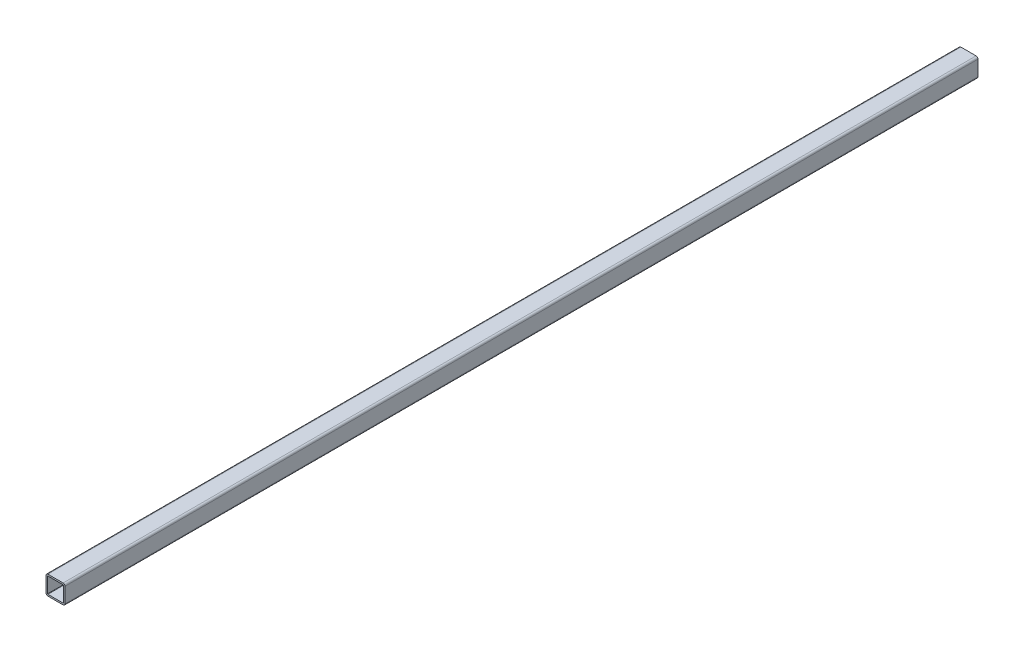
ISO-10303-21;
HEADER;
FILE_DESCRIPTION(('STEP AP214'),'2;1');
FILE_NAME('part.step','',(''),(''),'','','');
FILE_SCHEMA(('AUTOMOTIVE_DESIGN { 1 0 10303 214 1 1 1 1 }'));
ENDSEC;
DATA;
#1=APPLICATION_CONTEXT('core data for automotive mechanical design processes');
#2=APPLICATION_PROTOCOL_DEFINITION('international standard','automotive_design',2000,#1);
#3=PRODUCT_CONTEXT('',#1,'mechanical');
#4=PRODUCT('Part','Part','',(#3));
#5=PRODUCT_RELATED_PRODUCT_CATEGORY('part','',(#4));
#6=PRODUCT_DEFINITION_FORMATION('','',#4);
#7=PRODUCT_DEFINITION_CONTEXT('part definition',#1,'design');
#8=PRODUCT_DEFINITION('design','',#6,#7);
#9=PRODUCT_DEFINITION_SHAPE('','',#8);
#10=(LENGTH_UNIT() NAMED_UNIT(*) SI_UNIT(.MILLI.,.METRE.));
#11=(NAMED_UNIT(*) PLANE_ANGLE_UNIT() SI_UNIT($,.RADIAN.));
#12=(NAMED_UNIT(*) SI_UNIT($,.STERADIAN.) SOLID_ANGLE_UNIT());
#13=UNCERTAINTY_MEASURE_WITH_UNIT(LENGTH_MEASURE(1.E-05),#10,'distance_accuracy_value','');
#14=(GEOMETRIC_REPRESENTATION_CONTEXT(3) GLOBAL_UNCERTAINTY_ASSIGNED_CONTEXT((#13)) GLOBAL_UNIT_ASSIGNED_CONTEXT((#10,
#11,#12)) REPRESENTATION_CONTEXT('',''));
#15=CARTESIAN_POINT('',(0.,0.,0.));
#16=DIRECTION('',(0.,0.,1.));
#17=DIRECTION('',(1.,0.,0.));
#18=AXIS2_PLACEMENT_3D('',#15,#16,#17);
#19=CARTESIAN_POINT('',(0.,0.,457.2));
#20=DIRECTION('',(0.,0.,1.));
#21=DIRECTION('',(1.,0.,0.));
#22=AXIS2_PLACEMENT_3D('',#19,#20,#21);
#23=PLANE('',#22);
#24=DIRECTION('',(0.,-1.,0.));
#25=VECTOR('',#24,1.);
#26=CARTESIAN_POINT('',(-9.525,-9.525,457.2));
#27=LINE('',#26,#25);
#28=CARTESIAN_POINT('',(-9.525,7.61999999999999,457.2));
#29=VERTEX_POINT('',#28);
#30=CARTESIAN_POINT('',(-9.525,-7.62,457.2));
#31=VERTEX_POINT('',#30);
#32=EDGE_CURVE('E198',#29,#31,#27,.T.);
#33=ORIENTED_EDGE('',*,*,#32,.T.);
#34=CARTESIAN_POINT('',(-7.62,-7.62,457.2));
#35=DIRECTION('',(0.,0.,1.));
#36=DIRECTION('',(1.,0.,0.));
#37=AXIS2_PLACEMENT_3D('',#34,#35,#36);
#38=CIRCLE('',#37,1.905);
#39=CARTESIAN_POINT('',(-7.62,-9.525,457.2));
#40=VERTEX_POINT('',#39);
#41=EDGE_CURVE('E229',#31,#40,#38,.T.);
#42=ORIENTED_EDGE('',*,*,#41,.T.);
#43=DIRECTION('',(1.,0.,0.));
#44=VECTOR('',#43,1.);
#45=CARTESIAN_POINT('',(-9.525,-9.525,457.2));
#46=LINE('',#45,#44);
#47=CARTESIAN_POINT('',(7.61999999999999,-9.525,457.2));
#48=VERTEX_POINT('',#47);
#49=EDGE_CURVE('E177',#40,#48,#46,.T.);
#50=ORIENTED_EDGE('',*,*,#49,.T.);
#51=CARTESIAN_POINT('',(7.62,-7.62,457.2));
#52=DIRECTION('',(0.,0.,1.));
#53=DIRECTION('',(1.,0.,0.));
#54=AXIS2_PLACEMENT_3D('',#51,#52,#53);
#55=CIRCLE('',#54,1.905);
#56=CARTESIAN_POINT('',(9.525,-7.62,457.2));
#57=VERTEX_POINT('',#56);
#58=EDGE_CURVE('E223',#48,#57,#55,.T.);
#59=ORIENTED_EDGE('',*,*,#58,.T.);
#60=DIRECTION('',(0.,1.,0.));
#61=VECTOR('',#60,1.);
#62=CARTESIAN_POINT('',(9.525,-9.525,457.2));
#63=LINE('',#62,#61);
#64=CARTESIAN_POINT('',(9.525,7.61999999999999,457.2));
#65=VERTEX_POINT('',#64);
#66=EDGE_CURVE('E330',#57,#65,#63,.T.);
#67=ORIENTED_EDGE('',*,*,#66,.T.);
#68=CARTESIAN_POINT('',(7.62,7.62,457.2));
#69=DIRECTION('',(0.,0.,1.));
#70=DIRECTION('',(1.,0.,0.));
#71=AXIS2_PLACEMENT_3D('',#68,#69,#70);
#72=CIRCLE('',#71,1.905);
#73=CARTESIAN_POINT('',(7.61999999999999,9.525,457.2));
#74=VERTEX_POINT('',#73);
#75=EDGE_CURVE('E220',#65,#74,#72,.T.);
#76=ORIENTED_EDGE('',*,*,#75,.T.);
#77=DIRECTION('',(-1.,0.,0.));
#78=VECTOR('',#77,1.);
#79=CARTESIAN_POINT('',(-9.525,9.525,457.2));
#80=LINE('',#79,#78);
#81=CARTESIAN_POINT('',(-7.62,9.525,457.2));
#82=VERTEX_POINT('',#81);
#83=EDGE_CURVE('E333',#74,#82,#80,.T.);
#84=ORIENTED_EDGE('',*,*,#83,.T.);
#85=CARTESIAN_POINT('',(-7.62,7.62,457.2));
#86=DIRECTION('',(0.,0.,1.));
#87=DIRECTION('',(1.,0.,0.));
#88=AXIS2_PLACEMENT_3D('',#85,#86,#87);
#89=CIRCLE('',#88,1.905);
#90=EDGE_CURVE('E226',#82,#29,#89,.T.);
#91=ORIENTED_EDGE('',*,*,#90,.T.);
#92=EDGE_LOOP('',(#33,#42,#50,#59,#67,#76,#84,#91));
#93=FACE_BOUND('',#92,.T.);
#94=DIRECTION('',(0.,1.,0.));
#95=VECTOR('',#94,1.);
#96=CARTESIAN_POINT('',(7.9375,-7.9375,457.2));
#97=LINE('',#96,#95);
#98=CARTESIAN_POINT('',(7.9375,-7.62,457.2));
#99=VERTEX_POINT('',#98);
#100=CARTESIAN_POINT('',(7.9375,7.62,457.2));
#101=VERTEX_POINT('',#100);
#102=EDGE_CURVE('E311',#99,#101,#97,.T.);
#103=ORIENTED_EDGE('',*,*,#102,.F.);
#104=CARTESIAN_POINT('',(7.62,-7.62,457.2));
#105=DIRECTION('',(0.,0.,1.));
#106=DIRECTION('',(1.,0.,0.));
#107=AXIS2_PLACEMENT_3D('',#104,#105,#106);
#108=CIRCLE('',#107,0.3175);
#109=CARTESIAN_POINT('',(7.62,-7.9375,457.2));
#110=VERTEX_POINT('',#109);
#111=EDGE_CURVE('E282',#99,#110,#108,.F.);
#112=ORIENTED_EDGE('',*,*,#111,.T.);
#113=DIRECTION('',(1.,0.,0.));
#114=VECTOR('',#113,1.);
#115=CARTESIAN_POINT('',(-7.9375,-7.9375,457.2));
#116=LINE('',#115,#114);
#117=CARTESIAN_POINT('',(-7.62,-7.9375,457.2));
#118=VERTEX_POINT('',#117);
#119=EDGE_CURVE('E300',#118,#110,#116,.T.);
#120=ORIENTED_EDGE('',*,*,#119,.F.);
#121=CARTESIAN_POINT('',(-7.62,-7.62,457.2));
#122=DIRECTION('',(0.,0.,1.));
#123=DIRECTION('',(1.,0.,0.));
#124=AXIS2_PLACEMENT_3D('',#121,#122,#123);
#125=CIRCLE('',#124,0.3175);
#126=CARTESIAN_POINT('',(-7.9375,-7.62,457.2));
#127=VERTEX_POINT('',#126);
#128=EDGE_CURVE('E57',#118,#127,#125,.F.);
#129=ORIENTED_EDGE('',*,*,#128,.T.);
#130=DIRECTION('',(0.,-1.,0.));
#131=VECTOR('',#130,1.);
#132=CARTESIAN_POINT('',(-7.9375,-7.9375,457.2));
#133=LINE('',#132,#131);
#134=CARTESIAN_POINT('',(-7.9375,7.62,457.2));
#135=VERTEX_POINT('',#134);
#136=EDGE_CURVE('E188',#135,#127,#133,.T.);
#137=ORIENTED_EDGE('',*,*,#136,.F.);
#138=CARTESIAN_POINT('',(-7.62,7.62,457.2));
#139=DIRECTION('',(0.,0.,1.));
#140=DIRECTION('',(1.,0.,0.));
#141=AXIS2_PLACEMENT_3D('',#138,#139,#140);
#142=CIRCLE('',#141,0.3175);
#143=CARTESIAN_POINT('',(-7.62,7.9375,457.2));
#144=VERTEX_POINT('',#143);
#145=EDGE_CURVE('E11',#135,#144,#142,.F.);
#146=ORIENTED_EDGE('',*,*,#145,.T.);
#147=DIRECTION('',(-1.,0.,0.));
#148=VECTOR('',#147,1.);
#149=CARTESIAN_POINT('',(-7.9375,7.9375,457.2));
#150=LINE('',#149,#148);
#151=CARTESIAN_POINT('',(7.62,7.9375,457.2));
#152=VERTEX_POINT('',#151);
#153=EDGE_CURVE('E195',#152,#144,#150,.T.);
#154=ORIENTED_EDGE('',*,*,#153,.F.);
#155=CARTESIAN_POINT('',(7.62,7.62,457.2));
#156=DIRECTION('',(0.,0.,1.));
#157=DIRECTION('',(1.,0.,0.));
#158=AXIS2_PLACEMENT_3D('',#155,#156,#157);
#159=CIRCLE('',#158,0.3175);
#160=EDGE_CURVE('E276',#152,#101,#159,.F.);
#161=ORIENTED_EDGE('',*,*,#160,.T.);
#162=EDGE_LOOP('',(#103,#112,#120,#129,#137,#146,#154,#161));
#163=FACE_BOUND('',#162,.T.);
#164=ADVANCED_FACE('F41',(#93,#163),#23,.T.);
#165=CARTESIAN_POINT('',(0.,0.,-457.2));
#166=DIRECTION('',(0.,0.,1.));
#167=DIRECTION('',(1.,0.,0.));
#168=AXIS2_PLACEMENT_3D('',#165,#166,#167);
#169=PLANE('',#168);
#170=DIRECTION('',(1.,0.,0.));
#171=VECTOR('',#170,1.);
#172=CARTESIAN_POINT('',(-9.525,-9.525,-457.2));
#173=LINE('',#172,#171);
#174=CARTESIAN_POINT('',(-7.62,-9.525,-457.2));
#175=VERTEX_POINT('',#174);
#176=CARTESIAN_POINT('',(7.61999999999999,-9.525,-457.2));
#177=VERTEX_POINT('',#176);
#178=EDGE_CURVE('E174',#175,#177,#173,.T.);
#179=ORIENTED_EDGE('',*,*,#178,.F.);
#180=CARTESIAN_POINT('',(-7.62,-7.62,-457.2));
#181=DIRECTION('',(0.,0.,1.));
#182=DIRECTION('',(1.,0.,0.));
#183=AXIS2_PLACEMENT_3D('',#180,#181,#182);
#184=CIRCLE('',#183,1.905);
#185=CARTESIAN_POINT('',(-9.525,-7.62,-457.2));
#186=VERTEX_POINT('',#185);
#187=EDGE_CURVE('E156',#175,#186,#184,.F.);
#188=ORIENTED_EDGE('',*,*,#187,.T.);
#189=DIRECTION('',(0.,-1.,0.));
#190=VECTOR('',#189,1.);
#191=CARTESIAN_POINT('',(-9.525,-9.525,-457.2));
#192=LINE('',#191,#190);
#193=CARTESIAN_POINT('',(-9.525,7.61999999999999,-457.2));
#194=VERTEX_POINT('',#193);
#195=EDGE_CURVE('E204',#194,#186,#192,.T.);
#196=ORIENTED_EDGE('',*,*,#195,.F.);
#197=CARTESIAN_POINT('',(-7.62,7.62,-457.2));
#198=DIRECTION('',(0.,0.,1.));
#199=DIRECTION('',(1.,0.,0.));
#200=AXIS2_PLACEMENT_3D('',#197,#198,#199);
#201=CIRCLE('',#200,1.905);
#202=CARTESIAN_POINT('',(-7.62,9.525,-457.2));
#203=VERTEX_POINT('',#202);
#204=EDGE_CURVE('E168',#194,#203,#201,.F.);
#205=ORIENTED_EDGE('',*,*,#204,.T.);
#206=DIRECTION('',(-1.,0.,0.));
#207=VECTOR('',#206,1.);
#208=CARTESIAN_POINT('',(-9.525,9.525,-457.2));
#209=LINE('',#208,#207);
#210=CARTESIAN_POINT('',(7.61999999999999,9.525,-457.2));
#211=VERTEX_POINT('',#210);
#212=EDGE_CURVE('E193',#211,#203,#209,.T.);
#213=ORIENTED_EDGE('',*,*,#212,.F.);
#214=CARTESIAN_POINT('',(7.62,7.62,-457.2));
#215=DIRECTION('',(0.,0.,1.));
#216=DIRECTION('',(1.,0.,0.));
#217=AXIS2_PLACEMENT_3D('',#214,#215,#216);
#218=CIRCLE('',#217,1.905);
#219=CARTESIAN_POINT('',(9.525,7.61999999999999,-457.2));
#220=VERTEX_POINT('',#219);
#221=EDGE_CURVE('E179',#211,#220,#218,.F.);
#222=ORIENTED_EDGE('',*,*,#221,.T.);
#223=DIRECTION('',(0.,1.,0.));
#224=VECTOR('',#223,1.);
#225=CARTESIAN_POINT('',(9.525,-9.525,-457.2));
#226=LINE('',#225,#224);
#227=CARTESIAN_POINT('',(9.525,-7.62,-457.2));
#228=VERTEX_POINT('',#227);
#229=EDGE_CURVE('E187',#228,#220,#226,.T.);
#230=ORIENTED_EDGE('',*,*,#229,.F.);
#231=CARTESIAN_POINT('',(7.62,-7.62,-457.2));
#232=DIRECTION('',(0.,0.,1.));
#233=DIRECTION('',(1.,0.,0.));
#234=AXIS2_PLACEMENT_3D('',#231,#232,#233);
#235=CIRCLE('',#234,1.905);
#236=EDGE_CURVE('E185',#228,#177,#235,.F.);
#237=ORIENTED_EDGE('',*,*,#236,.T.);
#238=EDGE_LOOP('',(#179,#188,#196,#205,#213,#222,#230,#237));
#239=FACE_BOUND('',#238,.T.);
#240=DIRECTION('',(0.,-1.,0.));
#241=VECTOR('',#240,1.);
#242=CARTESIAN_POINT('',(-7.9375,-7.9375,-457.2));
#243=LINE('',#242,#241);
#244=CARTESIAN_POINT('',(-7.9375,7.62,-457.2));
#245=VERTEX_POINT('',#244);
#246=CARTESIAN_POINT('',(-7.9375,-7.62,-457.2));
#247=VERTEX_POINT('',#246);
#248=EDGE_CURVE('E292',#245,#247,#243,.T.);
#249=ORIENTED_EDGE('',*,*,#248,.T.);
#250=CARTESIAN_POINT('',(-7.62,-7.62,-457.2));
#251=DIRECTION('',(0.,0.,1.));
#252=DIRECTION('',(1.,0.,0.));
#253=AXIS2_PLACEMENT_3D('',#250,#251,#252);
#254=CIRCLE('',#253,0.3175);
#255=CARTESIAN_POINT('',(-7.62,-7.9375,-457.2));
#256=VERTEX_POINT('',#255);
#257=EDGE_CURVE('E285',#247,#256,#254,.T.);
#258=ORIENTED_EDGE('',*,*,#257,.T.);
#259=DIRECTION('',(1.,0.,0.));
#260=VECTOR('',#259,1.);
#261=CARTESIAN_POINT('',(-7.9375,-7.9375,-457.2));
#262=LINE('',#261,#260);
#263=CARTESIAN_POINT('',(7.62,-7.9375,-457.2));
#264=VERTEX_POINT('',#263);
#265=EDGE_CURVE('E318',#256,#264,#262,.T.);
#266=ORIENTED_EDGE('',*,*,#265,.T.);
#267=CARTESIAN_POINT('',(7.62,-7.62,-457.2));
#268=DIRECTION('',(0.,0.,1.));
#269=DIRECTION('',(1.,0.,0.));
#270=AXIS2_PLACEMENT_3D('',#267,#268,#269);
#271=CIRCLE('',#270,0.3175);
#272=CARTESIAN_POINT('',(7.9375,-7.62,-457.2));
#273=VERTEX_POINT('',#272);
#274=EDGE_CURVE('E279',#264,#273,#271,.T.);
#275=ORIENTED_EDGE('',*,*,#274,.T.);
#276=DIRECTION('',(0.,1.,0.));
#277=VECTOR('',#276,1.);
#278=CARTESIAN_POINT('',(7.9375,-7.9375,-457.2));
#279=LINE('',#278,#277);
#280=CARTESIAN_POINT('',(7.9375,7.62,-457.2));
#281=VERTEX_POINT('',#280);
#282=EDGE_CURVE('E322',#273,#281,#279,.T.);
#283=ORIENTED_EDGE('',*,*,#282,.T.);
#284=CARTESIAN_POINT('',(7.62,7.62,-457.2));
#285=DIRECTION('',(0.,0.,1.));
#286=DIRECTION('',(1.,0.,0.));
#287=AXIS2_PLACEMENT_3D('',#284,#285,#286);
#288=CIRCLE('',#287,0.3175);
#289=CARTESIAN_POINT('',(7.62,7.9375,-457.2));
#290=VERTEX_POINT('',#289);
#291=EDGE_CURVE('E273',#281,#290,#288,.T.);
#292=ORIENTED_EDGE('',*,*,#291,.T.);
#293=DIRECTION('',(-1.,0.,0.));
#294=VECTOR('',#293,1.);
#295=CARTESIAN_POINT('',(-7.9375,7.9375,-457.2));
#296=LINE('',#295,#294);
#297=CARTESIAN_POINT('',(-7.62,7.9375,-457.2));
#298=VERTEX_POINT('',#297);
#299=EDGE_CURVE('E294',#290,#298,#296,.T.);
#300=ORIENTED_EDGE('',*,*,#299,.T.);
#301=CARTESIAN_POINT('',(-7.62,7.62,-457.2));
#302=DIRECTION('',(0.,0.,1.));
#303=DIRECTION('',(1.,0.,0.));
#304=AXIS2_PLACEMENT_3D('',#301,#302,#303);
#305=CIRCLE('',#304,0.3175);
#306=EDGE_CURVE('E50',#298,#245,#305,.T.);
#307=ORIENTED_EDGE('',*,*,#306,.T.);
#308=EDGE_LOOP('',(#249,#258,#266,#275,#283,#292,#300,#307));
#309=FACE_BOUND('',#308,.T.);
#310=ADVANCED_FACE('F182',(#239,#309),#169,.F.);
#311=CARTESIAN_POINT('',(-9.525,-9.525,457.2));
#312=DIRECTION('',(0.,1.,0.));
#313=DIRECTION('',(0.,0.,1.));
#314=AXIS2_PLACEMENT_3D('',#311,#312,#313);
#315=PLANE('',#314);
#316=ORIENTED_EDGE('',*,*,#49,.F.);
#317=DIRECTION('',(0.,0.,-1.));
#318=VECTOR('',#317,1.);
#319=CARTESIAN_POINT('',(-7.62,-9.525,457.2));
#320=LINE('',#319,#318);
#321=EDGE_CURVE('E160',#40,#175,#320,.T.);
#322=ORIENTED_EDGE('',*,*,#321,.T.);
#323=ORIENTED_EDGE('',*,*,#178,.T.);
#324=DIRECTION('',(0.,0.,-1.));
#325=VECTOR('',#324,1.);
#326=CARTESIAN_POINT('',(7.62,-9.525,457.2));
#327=LINE('',#326,#325);
#328=EDGE_CURVE('E180',#177,#48,#327,.F.);
#329=ORIENTED_EDGE('',*,*,#328,.T.);
#330=EDGE_LOOP('',(#316,#322,#323,#329));
#331=FACE_BOUND('',#330,.T.);
#332=ADVANCED_FACE('F173',(#331),#315,.F.);
#333=CARTESIAN_POINT('',(9.525,-9.525,457.2));
#334=DIRECTION('',(-1.,0.,0.));
#335=DIRECTION('',(0.,0.,1.));
#336=AXIS2_PLACEMENT_3D('',#333,#334,#335);
#337=PLANE('',#336);
#338=ORIENTED_EDGE('',*,*,#66,.F.);
#339=DIRECTION('',(0.,0.,-1.));
#340=VECTOR('',#339,1.);
#341=CARTESIAN_POINT('',(9.525,-7.62,457.2));
#342=LINE('',#341,#340);
#343=EDGE_CURVE('E242',#57,#228,#342,.T.);
#344=ORIENTED_EDGE('',*,*,#343,.T.);
#345=ORIENTED_EDGE('',*,*,#229,.T.);
#346=DIRECTION('',(0.,0.,-1.));
#347=VECTOR('',#346,1.);
#348=CARTESIAN_POINT('',(9.525,7.62,457.2));
#349=LINE('',#348,#347);
#350=EDGE_CURVE('E239',#220,#65,#349,.F.);
#351=ORIENTED_EDGE('',*,*,#350,.T.);
#352=EDGE_LOOP('',(#338,#344,#345,#351));
#353=FACE_BOUND('',#352,.T.);
#354=ADVANCED_FACE('F358',(#353),#337,.F.);
#355=CARTESIAN_POINT('',(-9.525,9.525,457.2));
#356=DIRECTION('',(0.,-1.,0.));
#357=DIRECTION('',(0.,0.,-1.));
#358=AXIS2_PLACEMENT_3D('',#355,#356,#357);
#359=PLANE('',#358);
#360=ORIENTED_EDGE('',*,*,#212,.T.);
#361=DIRECTION('',(0.,0.,-1.));
#362=VECTOR('',#361,1.);
#363=CARTESIAN_POINT('',(-7.62,9.525,457.2));
#364=LINE('',#363,#362);
#365=EDGE_CURVE('E236',#203,#82,#364,.F.);
#366=ORIENTED_EDGE('',*,*,#365,.T.);
#367=ORIENTED_EDGE('',*,*,#83,.F.);
#368=DIRECTION('',(0.,0.,-1.));
#369=VECTOR('',#368,1.);
#370=CARTESIAN_POINT('',(7.62,9.525,457.2));
#371=LINE('',#370,#369);
#372=EDGE_CURVE('E232',#74,#211,#371,.T.);
#373=ORIENTED_EDGE('',*,*,#372,.T.);
#374=EDGE_LOOP('',(#360,#366,#367,#373));
#375=FACE_BOUND('',#374,.T.);
#376=ADVANCED_FACE('F350',(#375),#359,.F.);
#377=CARTESIAN_POINT('',(-9.525,-9.525,457.2));
#378=DIRECTION('',(1.,0.,0.));
#379=DIRECTION('',(0.,0.,-1.));
#380=AXIS2_PLACEMENT_3D('',#377,#378,#379);
#381=PLANE('',#380);
#382=ORIENTED_EDGE('',*,*,#195,.T.);
#383=DIRECTION('',(0.,0.,-1.));
#384=VECTOR('',#383,1.);
#385=CARTESIAN_POINT('',(-9.525,-7.62,457.2));
#386=LINE('',#385,#384);
#387=EDGE_CURVE('E161',#186,#31,#386,.F.);
#388=ORIENTED_EDGE('',*,*,#387,.T.);
#389=ORIENTED_EDGE('',*,*,#32,.F.);
#390=DIRECTION('',(0.,0.,-1.));
#391=VECTOR('',#390,1.);
#392=CARTESIAN_POINT('',(-9.525,7.62,457.2));
#393=LINE('',#392,#391);
#394=EDGE_CURVE('E167',#29,#194,#393,.T.);
#395=ORIENTED_EDGE('',*,*,#394,.T.);
#396=EDGE_LOOP('',(#382,#388,#389,#395));
#397=FACE_BOUND('',#396,.T.);
#398=ADVANCED_FACE('F344',(#397),#381,.F.);
#399=CARTESIAN_POINT('',(-7.9375,-7.9375,457.2));
#400=DIRECTION('',(0.,1.,0.));
#401=DIRECTION('',(-1.,0.,0.));
#402=AXIS2_PLACEMENT_3D('',#399,#400,#401);
#403=PLANE('',#402);
#404=ORIENTED_EDGE('',*,*,#119,.T.);
#405=DIRECTION('',(0.,0.,-1.));
#406=VECTOR('',#405,1.);
#407=CARTESIAN_POINT('',(7.62,-7.9375,-457.2));
#408=LINE('',#407,#406);
#409=EDGE_CURVE('E263',#110,#264,#408,.T.);
#410=ORIENTED_EDGE('',*,*,#409,.T.);
#411=ORIENTED_EDGE('',*,*,#265,.F.);
#412=DIRECTION('',(0.,0.,-1.));
#413=VECTOR('',#412,1.);
#414=CARTESIAN_POINT('',(-7.62,-7.9375,457.2));
#415=LINE('',#414,#413);
#416=EDGE_CURVE('E260',#256,#118,#415,.F.);
#417=ORIENTED_EDGE('',*,*,#416,.T.);
#418=EDGE_LOOP('',(#404,#410,#411,#417));
#419=FACE_BOUND('',#418,.T.);
#420=ADVANCED_FACE('F379',(#419),#403,.T.);
#421=CARTESIAN_POINT('',(7.9375,-7.9375,457.2));
#422=DIRECTION('',(-1.,0.,0.));
#423=DIRECTION('',(0.,0.,1.));
#424=AXIS2_PLACEMENT_3D('',#421,#422,#423);
#425=PLANE('',#424);
#426=ORIENTED_EDGE('',*,*,#102,.T.);
#427=DIRECTION('',(0.,0.,-1.));
#428=VECTOR('',#427,1.);
#429=CARTESIAN_POINT('',(7.9375,7.62,-457.2));
#430=LINE('',#429,#428);
#431=EDGE_CURVE('E249',#101,#281,#430,.T.);
#432=ORIENTED_EDGE('',*,*,#431,.T.);
#433=ORIENTED_EDGE('',*,*,#282,.F.);
#434=DIRECTION('',(0.,0.,-1.));
#435=VECTOR('',#434,1.);
#436=CARTESIAN_POINT('',(7.9375,-7.62,457.2));
#437=LINE('',#436,#435);
#438=EDGE_CURVE('E246',#273,#99,#437,.F.);
#439=ORIENTED_EDGE('',*,*,#438,.T.);
#440=EDGE_LOOP('',(#426,#432,#433,#439));
#441=FACE_BOUND('',#440,.T.);
#442=ADVANCED_FACE('F398',(#441),#425,.T.);
#443=CARTESIAN_POINT('',(-7.9375,7.9375,457.2));
#444=DIRECTION('',(0.,-1.,0.));
#445=DIRECTION('',(1.,0.,0.));
#446=AXIS2_PLACEMENT_3D('',#443,#444,#445);
#447=PLANE('',#446);
#448=ORIENTED_EDGE('',*,*,#299,.F.);
#449=DIRECTION('',(0.,0.,-1.));
#450=VECTOR('',#449,1.);
#451=CARTESIAN_POINT('',(7.62,7.9375,457.2));
#452=LINE('',#451,#450);
#453=EDGE_CURVE('E257',#290,#152,#452,.F.);
#454=ORIENTED_EDGE('',*,*,#453,.T.);
#455=ORIENTED_EDGE('',*,*,#153,.T.);
#456=DIRECTION('',(0.,0.,-1.));
#457=VECTOR('',#456,1.);
#458=CARTESIAN_POINT('',(-7.62,7.9375,-457.2));
#459=LINE('',#458,#457);
#460=EDGE_CURVE('E253',#144,#298,#459,.T.);
#461=ORIENTED_EDGE('',*,*,#460,.T.);
#462=EDGE_LOOP('',(#448,#454,#455,#461));
#463=FACE_BOUND('',#462,.T.);
#464=ADVANCED_FACE('F308',(#463),#447,.T.);
#465=CARTESIAN_POINT('',(-7.9375,-7.9375,457.2));
#466=DIRECTION('',(1.,0.,0.));
#467=DIRECTION('',(0.,1.,0.));
#468=AXIS2_PLACEMENT_3D('',#465,#466,#467);
#469=PLANE('',#468);
#470=ORIENTED_EDGE('',*,*,#136,.T.);
#471=DIRECTION('',(0.,0.,-1.));
#472=VECTOR('',#471,1.);
#473=CARTESIAN_POINT('',(-7.9375,-7.62,-457.2));
#474=LINE('',#473,#472);
#475=EDGE_CURVE('E269',#127,#247,#474,.T.);
#476=ORIENTED_EDGE('',*,*,#475,.T.);
#477=ORIENTED_EDGE('',*,*,#248,.F.);
#478=DIRECTION('',(0.,0.,-1.));
#479=VECTOR('',#478,1.);
#480=CARTESIAN_POINT('',(-7.9375,7.62,457.2));
#481=LINE('',#480,#479);
#482=EDGE_CURVE('E64',#245,#135,#481,.F.);
#483=ORIENTED_EDGE('',*,*,#482,.T.);
#484=EDGE_LOOP('',(#470,#476,#477,#483));
#485=FACE_BOUND('',#484,.T.);
#486=ADVANCED_FACE('F297',(#485),#469,.T.);
#487=CARTESIAN_POINT('',(-7.62,-7.62,457.2));
#488=DIRECTION('',(0.,0.,-1.));
#489=DIRECTION('',(-1.,0.,0.));
#490=AXIS2_PLACEMENT_3D('',#487,#488,#489);
#491=CYLINDRICAL_SURFACE('',#490,1.905);
#492=ORIENTED_EDGE('',*,*,#41,.F.);
#493=ORIENTED_EDGE('',*,*,#387,.F.);
#494=ORIENTED_EDGE('',*,*,#187,.F.);
#495=ORIENTED_EDGE('',*,*,#321,.F.);
#496=EDGE_LOOP('',(#492,#493,#494,#495));
#497=FACE_BOUND('',#496,.T.);
#498=ADVANCED_FACE('F159',(#497),#491,.T.);
#499=CARTESIAN_POINT('',(-7.62,7.62,457.2));
#500=DIRECTION('',(0.,0.,-1.));
#501=DIRECTION('',(-1.,0.,0.));
#502=AXIS2_PLACEMENT_3D('',#499,#500,#501);
#503=CYLINDRICAL_SURFACE('',#502,1.905);
#504=ORIENTED_EDGE('',*,*,#90,.F.);
#505=ORIENTED_EDGE('',*,*,#365,.F.);
#506=ORIENTED_EDGE('',*,*,#204,.F.);
#507=ORIENTED_EDGE('',*,*,#394,.F.);
#508=EDGE_LOOP('',(#504,#505,#506,#507));
#509=FACE_BOUND('',#508,.T.);
#510=ADVANCED_FACE('F346',(#509),#503,.T.);
#511=CARTESIAN_POINT('',(7.62,-7.62,457.2));
#512=DIRECTION('',(0.,0.,-1.));
#513=DIRECTION('',(-1.,0.,0.));
#514=AXIS2_PLACEMENT_3D('',#511,#512,#513);
#515=CYLINDRICAL_SURFACE('',#514,1.905);
#516=ORIENTED_EDGE('',*,*,#58,.F.);
#517=ORIENTED_EDGE('',*,*,#328,.F.);
#518=ORIENTED_EDGE('',*,*,#236,.F.);
#519=ORIENTED_EDGE('',*,*,#343,.F.);
#520=EDGE_LOOP('',(#516,#517,#518,#519));
#521=FACE_BOUND('',#520,.T.);
#522=ADVANCED_FACE('F362',(#521),#515,.T.);
#523=CARTESIAN_POINT('',(7.62,7.62,457.2));
#524=DIRECTION('',(0.,0.,-1.));
#525=DIRECTION('',(-1.,0.,0.));
#526=AXIS2_PLACEMENT_3D('',#523,#524,#525);
#527=CYLINDRICAL_SURFACE('',#526,1.905);
#528=ORIENTED_EDGE('',*,*,#75,.F.);
#529=ORIENTED_EDGE('',*,*,#350,.F.);
#530=ORIENTED_EDGE('',*,*,#221,.F.);
#531=ORIENTED_EDGE('',*,*,#372,.F.);
#532=EDGE_LOOP('',(#528,#529,#530,#531));
#533=FACE_BOUND('',#532,.T.);
#534=ADVANCED_FACE('F354',(#533),#527,.T.);
#535=CARTESIAN_POINT('',(7.62,7.62,457.2));
#536=DIRECTION('',(0.,0.,1.));
#537=DIRECTION('',(1.,0.,0.));
#538=AXIS2_PLACEMENT_3D('',#535,#536,#537);
#539=CYLINDRICAL_SURFACE('',#538,0.3175);
#540=ORIENTED_EDGE('',*,*,#160,.F.);
#541=ORIENTED_EDGE('',*,*,#453,.F.);
#542=ORIENTED_EDGE('',*,*,#291,.F.);
#543=ORIENTED_EDGE('',*,*,#431,.F.);
#544=EDGE_LOOP('',(#540,#541,#542,#543));
#545=FACE_BOUND('',#544,.T.);
#546=ADVANCED_FACE('F369',(#545),#539,.F.);
#547=CARTESIAN_POINT('',(7.62,-7.62,457.2));
#548=DIRECTION('',(0.,0.,1.));
#549=DIRECTION('',(1.,0.,0.));
#550=AXIS2_PLACEMENT_3D('',#547,#548,#549);
#551=CYLINDRICAL_SURFACE('',#550,0.3175);
#552=ORIENTED_EDGE('',*,*,#111,.F.);
#553=ORIENTED_EDGE('',*,*,#438,.F.);
#554=ORIENTED_EDGE('',*,*,#274,.F.);
#555=ORIENTED_EDGE('',*,*,#409,.F.);
#556=EDGE_LOOP('',(#552,#553,#554,#555));
#557=FACE_BOUND('',#556,.T.);
#558=ADVANCED_FACE('F412',(#557),#551,.F.);
#559=CARTESIAN_POINT('',(-7.62,-7.62,457.2));
#560=DIRECTION('',(0.,0.,1.));
#561=DIRECTION('',(1.,0.,0.));
#562=AXIS2_PLACEMENT_3D('',#559,#560,#561);
#563=CYLINDRICAL_SURFACE('',#562,0.3175);
#564=ORIENTED_EDGE('',*,*,#128,.F.);
#565=ORIENTED_EDGE('',*,*,#416,.F.);
#566=ORIENTED_EDGE('',*,*,#257,.F.);
#567=ORIENTED_EDGE('',*,*,#475,.F.);
#568=EDGE_LOOP('',(#564,#565,#566,#567));
#569=FACE_BOUND('',#568,.T.);
#570=ADVANCED_FACE('F419',(#569),#563,.F.);
#571=CARTESIAN_POINT('',(-7.62,7.62,457.2));
#572=DIRECTION('',(0.,0.,1.));
#573=DIRECTION('',(1.,0.,0.));
#574=AXIS2_PLACEMENT_3D('',#571,#572,#573);
#575=CYLINDRICAL_SURFACE('',#574,0.3175);
#576=ORIENTED_EDGE('',*,*,#145,.F.);
#577=ORIENTED_EDGE('',*,*,#482,.F.);
#578=ORIENTED_EDGE('',*,*,#306,.F.);
#579=ORIENTED_EDGE('',*,*,#460,.F.);
#580=EDGE_LOOP('',(#576,#577,#578,#579));
#581=FACE_BOUND('',#580,.T.);
#582=ADVANCED_FACE('F43',(#581),#575,.F.);
#583=CLOSED_SHELL('',(#164,#310,#332,#354,#376,#398,#420,#442,#464,#486,#498,#510,#522,#534,
#546,#558,#570,#582));
#584=MANIFOLD_SOLID_BREP('B2',#583);
#585=ADVANCED_BREP_SHAPE_REPRESENTATION('',(#18,#584),#14);
#586=SHAPE_DEFINITION_REPRESENTATION(#9,#585);
ENDSEC;
END-ISO-10303-21;
